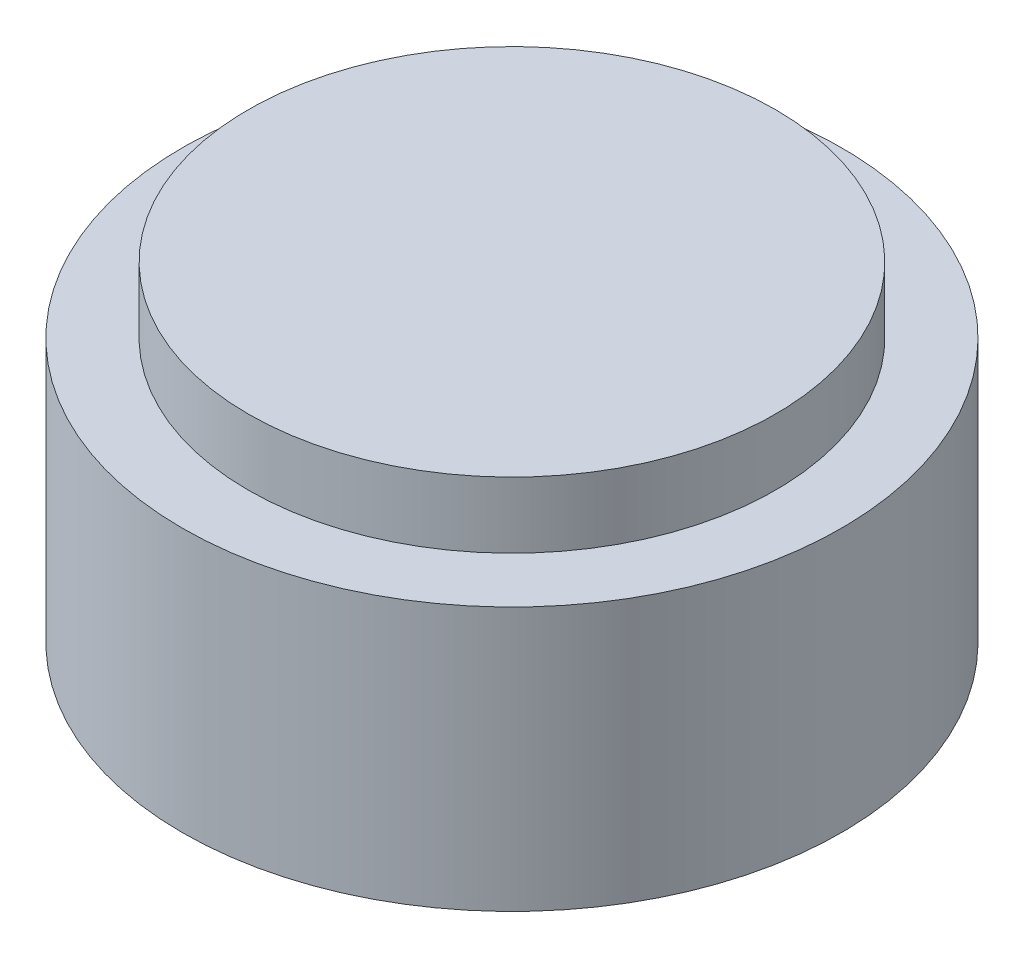
ISO-10303-21;
HEADER;
FILE_DESCRIPTION(('STEP AP214'),'2;1');
FILE_NAME('part.step','',(''),(''),'','','');
FILE_SCHEMA(('AUTOMOTIVE_DESIGN { 1 0 10303 214 1 1 1 1 }'));
ENDSEC;
DATA;
#1=APPLICATION_CONTEXT('core data for automotive mechanical design processes');
#2=APPLICATION_PROTOCOL_DEFINITION('international standard','automotive_design',2000,#1);
#3=PRODUCT_CONTEXT('',#1,'mechanical');
#4=PRODUCT('Part','Part','',(#3));
#5=PRODUCT_RELATED_PRODUCT_CATEGORY('part','',(#4));
#6=PRODUCT_DEFINITION_FORMATION('','',#4);
#7=PRODUCT_DEFINITION_CONTEXT('part definition',#1,'design');
#8=PRODUCT_DEFINITION('design','',#6,#7);
#9=PRODUCT_DEFINITION_SHAPE('','',#8);
#10=(LENGTH_UNIT() NAMED_UNIT(*) SI_UNIT(.MILLI.,.METRE.));
#11=(NAMED_UNIT(*) PLANE_ANGLE_UNIT() SI_UNIT($,.RADIAN.));
#12=(NAMED_UNIT(*) SI_UNIT($,.STERADIAN.) SOLID_ANGLE_UNIT());
#13=UNCERTAINTY_MEASURE_WITH_UNIT(LENGTH_MEASURE(1.E-05),#10,'distance_accuracy_value','');
#14=(GEOMETRIC_REPRESENTATION_CONTEXT(3) GLOBAL_UNCERTAINTY_ASSIGNED_CONTEXT((#13)) GLOBAL_UNIT_ASSIGNED_CONTEXT((#10,
#11,#12)) REPRESENTATION_CONTEXT('',''));
#15=CARTESIAN_POINT('',(0.,0.,0.));
#16=DIRECTION('',(0.,0.,1.));
#17=DIRECTION('',(1.,0.,0.));
#18=AXIS2_PLACEMENT_3D('',#15,#16,#17);
#19=CARTESIAN_POINT('',(0.,12.,0.));
#20=DIRECTION('',(0.,1.,0.));
#21=DIRECTION('',(0.,0.,1.));
#22=AXIS2_PLACEMENT_3D('',#19,#20,#21);
#23=PLANE('',#22);
#24=CARTESIAN_POINT('',(0.,12.,0.));
#25=DIRECTION('',(0.,1.,0.));
#26=DIRECTION('',(0.,0.,1.));
#27=AXIS2_PLACEMENT_3D('',#24,#25,#26);
#28=CIRCLE('',#27,12.);
#29=CARTESIAN_POINT('',(0.,12.,12.));
#30=VERTEX_POINT('',#29);
#31=EDGE_CURVE('E11',#30,#30,#28,.T.);
#32=ORIENTED_EDGE('',*,*,#31,.F.);
#33=EDGE_LOOP('',(#32));
#34=FACE_BOUND('',#33,.T.);
#35=CARTESIAN_POINT('',(0.,12.,0.));
#36=DIRECTION('',(0.,1.,0.));
#37=DIRECTION('',(0.,0.,1.));
#38=AXIS2_PLACEMENT_3D('',#35,#36,#37);
#39=CIRCLE('',#38,15.);
#40=CARTESIAN_POINT('',(0.,12.,15.));
#41=VERTEX_POINT('',#40);
#42=EDGE_CURVE('E49',#41,#41,#39,.T.);
#43=ORIENTED_EDGE('',*,*,#42,.T.);
#44=EDGE_LOOP('',(#43));
#45=FACE_BOUND('',#44,.T.);
#46=ADVANCED_FACE('F39',(#34,#45),#23,.T.);
#47=CARTESIAN_POINT('',(0.,0.,0.));
#48=DIRECTION('',(0.,1.,0.));
#49=DIRECTION('',(0.,0.,1.));
#50=AXIS2_PLACEMENT_3D('',#47,#48,#49);
#51=PLANE('',#50);
#52=CARTESIAN_POINT('',(0.,0.,0.));
#53=DIRECTION('',(0.,1.,0.));
#54=DIRECTION('',(0.,0.,1.));
#55=AXIS2_PLACEMENT_3D('',#52,#53,#54);
#56=CIRCLE('',#55,15.);
#57=CARTESIAN_POINT('',(0.,0.,15.));
#58=VERTEX_POINT('',#57);
#59=EDGE_CURVE('E43',#58,#58,#56,.T.);
#60=ORIENTED_EDGE('',*,*,#59,.F.);
#61=EDGE_LOOP('',(#60));
#62=FACE_BOUND('',#61,.T.);
#63=CARTESIAN_POINT('',(0.,0.,0.));
#64=DIRECTION('',(0.,1.,0.));
#65=DIRECTION('',(0.,0.,1.));
#66=AXIS2_PLACEMENT_3D('',#63,#64,#65);
#67=CIRCLE('',#66,3.2);
#68=CARTESIAN_POINT('',(-0.965663188596758,0.,-3.05081867802548));
#69=VERTEX_POINT('',#68);
#70=CARTESIAN_POINT('',(2.83678423421409,0.,-1.48076169875993));
#71=VERTEX_POINT('',#70);
#72=EDGE_CURVE('E64',#69,#71,#67,.T.);
#73=ORIENTED_EDGE('',*,*,#72,.T.);
#74=DIRECTION('',(-0.924305946257936,0.,-0.381652351901859));
#75=VECTOR('',#74,1.);
#76=CARTESIAN_POINT('',(-0.965663188596758,0.,-3.05081867802548));
#77=LINE('',#76,#75);
#78=EDGE_CURVE('E74',#71,#69,#77,.T.);
#79=ORIENTED_EDGE('',*,*,#78,.T.);
#80=EDGE_LOOP('',(#73,#79));
#81=FACE_BOUND('',#80,.T.);
#82=ADVANCED_FACE('F99',(#62,#81),#51,.F.);
#83=CARTESIAN_POINT('',(0.,12.,0.));
#84=DIRECTION('',(0.,-1.,0.));
#85=DIRECTION('',(0.,0.,-1.));
#86=AXIS2_PLACEMENT_3D('',#83,#84,#85);
#87=CYLINDRICAL_SURFACE('',#86,15.);
#88=ORIENTED_EDGE('',*,*,#42,.F.);
#89=EDGE_LOOP('',(#88));
#90=FACE_BOUND('',#89,.T.);
#91=ORIENTED_EDGE('',*,*,#59,.T.);
#92=EDGE_LOOP('',(#91));
#93=FACE_BOUND('',#92,.T.);
#94=ADVANCED_FACE('F41',(#90,#93),#87,.T.);
#95=CARTESIAN_POINT('',(0.,12.,0.));
#96=DIRECTION('',(0.,-1.,0.));
#97=DIRECTION('',(0.,0.,-1.));
#98=AXIS2_PLACEMENT_3D('',#95,#96,#97);
#99=CYLINDRICAL_SURFACE('',#98,3.2);
#100=ORIENTED_EDGE('',*,*,#72,.F.);
#101=DIRECTION('',(0.,-1.,0.));
#102=VECTOR('',#101,1.);
#103=CARTESIAN_POINT('',(-0.965663188596758,12.,-3.05081867802548));
#104=LINE('',#103,#102);
#105=CARTESIAN_POINT('',(-0.965663188596758,12.,-3.05081867802548));
#106=VERTEX_POINT('',#105);
#107=EDGE_CURVE('E78',#106,#69,#104,.T.);
#108=ORIENTED_EDGE('',*,*,#107,.F.);
#109=CARTESIAN_POINT('',(0.,12.,0.));
#110=DIRECTION('',(0.,1.,0.));
#111=DIRECTION('',(0.,0.,1.));
#112=AXIS2_PLACEMENT_3D('',#109,#110,#111);
#113=CIRCLE('',#112,3.2);
#114=CARTESIAN_POINT('',(2.83678423421409,12.,-1.48076169875993));
#115=VERTEX_POINT('',#114);
#116=EDGE_CURVE('E71',#106,#115,#113,.T.);
#117=ORIENTED_EDGE('',*,*,#116,.T.);
#118=DIRECTION('',(0.,-1.,0.));
#119=VECTOR('',#118,1.);
#120=CARTESIAN_POINT('',(2.83678423421409,12.,-1.48076169875993));
#121=LINE('',#120,#119);
#122=EDGE_CURVE('E80',#115,#71,#121,.T.);
#123=ORIENTED_EDGE('',*,*,#122,.T.);
#124=EDGE_LOOP('',(#100,#108,#117,#123));
#125=FACE_BOUND('',#124,.T.);
#126=ADVANCED_FACE('F83',(#125),#99,.F.);
#127=CARTESIAN_POINT('',(-0.965663188596758,12.,-3.05081867802548));
#128=DIRECTION('',(-0.381652351901859,0.,0.924305946257936));
#129=DIRECTION('',(0.924305946257937,0.,0.381652351901859));
#130=AXIS2_PLACEMENT_3D('',#127,#128,#129);
#131=PLANE('',#130);
#132=ORIENTED_EDGE('',*,*,#78,.F.);
#133=ORIENTED_EDGE('',*,*,#122,.F.);
#134=DIRECTION('',(-0.924305946257936,0.,-0.381652351901859));
#135=VECTOR('',#134,1.);
#136=CARTESIAN_POINT('',(-0.965663188596758,12.,-3.05081867802548));
#137=LINE('',#136,#135);
#138=EDGE_CURVE('E56',#115,#106,#137,.T.);
#139=ORIENTED_EDGE('',*,*,#138,.T.);
#140=ORIENTED_EDGE('',*,*,#107,.T.);
#141=EDGE_LOOP('',(#132,#133,#139,#140));
#142=FACE_BOUND('',#141,.T.);
#143=ADVANCED_FACE('F77',(#142),#131,.T.);
#144=CARTESIAN_POINT('',(0.,15.,0.));
#145=DIRECTION('',(0.,1.,0.));
#146=DIRECTION('',(0.,0.,1.));
#147=AXIS2_PLACEMENT_3D('',#144,#145,#146);
#148=PLANE('',#147);
#149=CARTESIAN_POINT('',(0.,15.,0.));
#150=DIRECTION('',(0.,1.,0.));
#151=DIRECTION('',(0.,0.,1.));
#152=AXIS2_PLACEMENT_3D('',#149,#150,#151);
#153=CIRCLE('',#152,12.);
#154=CARTESIAN_POINT('',(0.,15.,12.));
#155=VERTEX_POINT('',#154);
#156=EDGE_CURVE('E103',#155,#155,#153,.T.);
#157=ORIENTED_EDGE('',*,*,#156,.T.);
#158=EDGE_LOOP('',(#157));
#159=FACE_BOUND('',#158,.T.);
#160=ADVANCED_FACE('F110',(#159),#148,.T.);
#161=CARTESIAN_POINT('',(0.,15.,0.));
#162=DIRECTION('',(0.,-1.,0.));
#163=DIRECTION('',(0.,0.,-1.));
#164=AXIS2_PLACEMENT_3D('',#161,#162,#163);
#165=CYLINDRICAL_SURFACE('',#164,12.);
#166=ORIENTED_EDGE('',*,*,#156,.F.);
#167=EDGE_LOOP('',(#166));
#168=FACE_BOUND('',#167,.T.);
#169=ORIENTED_EDGE('',*,*,#31,.T.);
#170=EDGE_LOOP('',(#169));
#171=FACE_BOUND('',#170,.T.);
#172=ADVANCED_FACE('F112',(#168,#171),#165,.T.);
#173=CARTESIAN_POINT('',(0.,12.,0.));
#174=DIRECTION('',(0.,1.,0.));
#175=DIRECTION('',(0.,0.,1.));
#176=AXIS2_PLACEMENT_3D('',#173,#174,#175);
#177=PLANE('',#176);
#178=ORIENTED_EDGE('',*,*,#138,.F.);
#179=ORIENTED_EDGE('',*,*,#116,.F.);
#180=EDGE_LOOP('',(#178,#179));
#181=FACE_BOUND('',#180,.T.);
#182=ADVANCED_FACE('F72',(#181),#177,.F.);
#183=CLOSED_SHELL('',(#46,#82,#94,#126,#143,#160,#172,#182));
#184=MANIFOLD_SOLID_BREP('B2',#183);
#185=ADVANCED_BREP_SHAPE_REPRESENTATION('',(#18,#184),#14);
#186=SHAPE_DEFINITION_REPRESENTATION(#9,#185);
ENDSEC;
END-ISO-10303-21;
